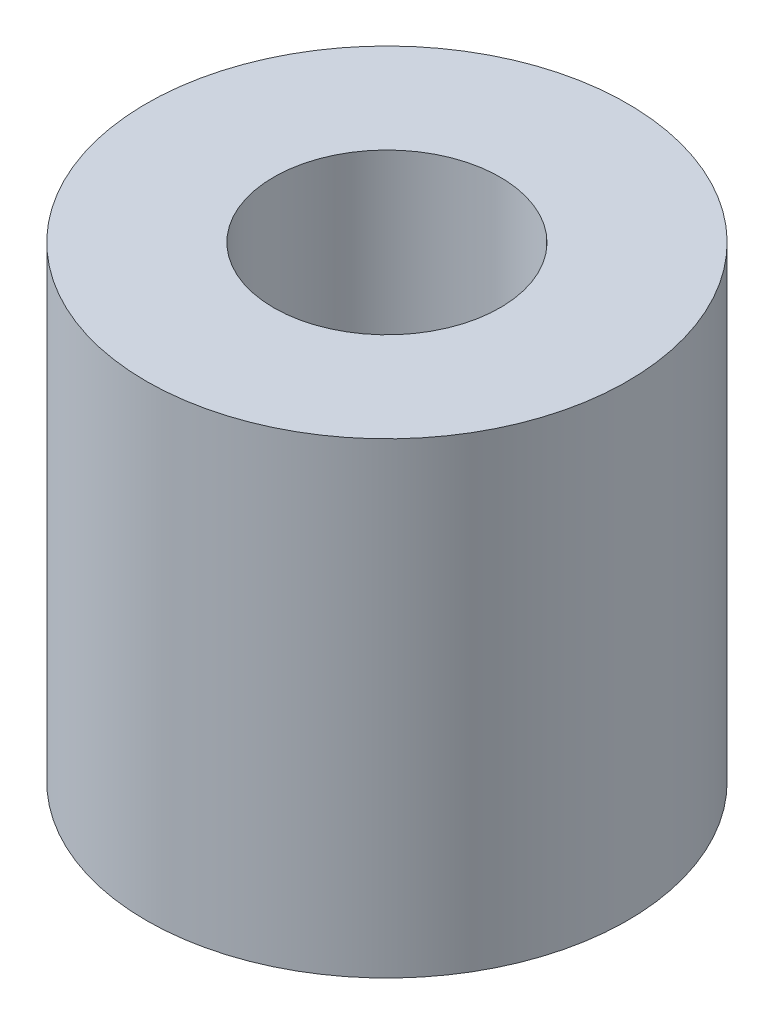
ISO-10303-21;
HEADER;
FILE_DESCRIPTION(('STEP AP214'),'2;1');
FILE_NAME('part.step','',(''),(''),'','','');
FILE_SCHEMA(('AUTOMOTIVE_DESIGN { 1 0 10303 214 1 1 1 1 }'));
ENDSEC;
DATA;
#1=APPLICATION_CONTEXT('core data for automotive mechanical design processes');
#2=APPLICATION_PROTOCOL_DEFINITION('international standard','automotive_design',2000,#1);
#3=PRODUCT_CONTEXT('',#1,'mechanical');
#4=PRODUCT('Part','Part','',(#3));
#5=PRODUCT_RELATED_PRODUCT_CATEGORY('part','',(#4));
#6=PRODUCT_DEFINITION_FORMATION('','',#4);
#7=PRODUCT_DEFINITION_CONTEXT('part definition',#1,'design');
#8=PRODUCT_DEFINITION('design','',#6,#7);
#9=PRODUCT_DEFINITION_SHAPE('','',#8);
#10=(LENGTH_UNIT() NAMED_UNIT(*) SI_UNIT(.MILLI.,.METRE.));
#11=(NAMED_UNIT(*) PLANE_ANGLE_UNIT() SI_UNIT($,.RADIAN.));
#12=(NAMED_UNIT(*) SI_UNIT($,.STERADIAN.) SOLID_ANGLE_UNIT());
#13=UNCERTAINTY_MEASURE_WITH_UNIT(LENGTH_MEASURE(1.E-05),#10,'distance_accuracy_value','');
#14=(GEOMETRIC_REPRESENTATION_CONTEXT(3) GLOBAL_UNCERTAINTY_ASSIGNED_CONTEXT((#13)) GLOBAL_UNIT_ASSIGNED_CONTEXT((#10,
#11,#12)) REPRESENTATION_CONTEXT('',''));
#15=CARTESIAN_POINT('',(0.,0.,0.));
#16=DIRECTION('',(0.,0.,1.));
#17=DIRECTION('',(1.,0.,0.));
#18=AXIS2_PLACEMENT_3D('',#15,#16,#17);
#19=CARTESIAN_POINT('',(0.,33.,0.));
#20=DIRECTION('',(0.,1.,0.));
#21=DIRECTION('',(0.,0.,1.));
#22=AXIS2_PLACEMENT_3D('',#19,#20,#21);
#23=PLANE('',#22);
#24=CARTESIAN_POINT('',(0.,33.,0.));
#25=DIRECTION('',(0.,1.,0.));
#26=DIRECTION('',(0.,0.,1.));
#27=AXIS2_PLACEMENT_3D('',#24,#25,#26);
#28=CIRCLE('',#27,17.);
#29=CARTESIAN_POINT('',(0.,33.,17.));
#30=VERTEX_POINT('',#29);
#31=EDGE_CURVE('E10',#30,#30,#28,.T.);
#32=ORIENTED_EDGE('',*,*,#31,.T.);
#33=EDGE_LOOP('',(#32));
#34=FACE_BOUND('',#33,.T.);
#35=CARTESIAN_POINT('',(0.,33.,0.));
#36=DIRECTION('',(0.,1.,0.));
#37=DIRECTION('',(0.,0.,1.));
#38=AXIS2_PLACEMENT_3D('',#35,#36,#37);
#39=CIRCLE('',#38,8.);
#40=CARTESIAN_POINT('',(0.,33.,8.));
#41=VERTEX_POINT('',#40);
#42=EDGE_CURVE('E45',#41,#41,#39,.T.);
#43=ORIENTED_EDGE('',*,*,#42,.F.);
#44=EDGE_LOOP('',(#43));
#45=FACE_BOUND('',#44,.T.);
#46=ADVANCED_FACE('F34',(#34,#45),#23,.T.);
#47=CARTESIAN_POINT('',(0.,0.,0.));
#48=DIRECTION('',(0.,1.,0.));
#49=DIRECTION('',(0.,0.,1.));
#50=AXIS2_PLACEMENT_3D('',#47,#48,#49);
#51=PLANE('',#50);
#52=CARTESIAN_POINT('',(0.,0.,0.));
#53=DIRECTION('',(0.,1.,0.));
#54=DIRECTION('',(0.,0.,1.));
#55=AXIS2_PLACEMENT_3D('',#52,#53,#54);
#56=CIRCLE('',#55,17.);
#57=CARTESIAN_POINT('',(0.,0.,17.));
#58=VERTEX_POINT('',#57);
#59=EDGE_CURVE('E38',#58,#58,#56,.T.);
#60=ORIENTED_EDGE('',*,*,#59,.F.);
#61=EDGE_LOOP('',(#60));
#62=FACE_BOUND('',#61,.T.);
#63=CARTESIAN_POINT('',(0.,0.,0.));
#64=DIRECTION('',(0.,1.,0.));
#65=DIRECTION('',(0.,0.,1.));
#66=AXIS2_PLACEMENT_3D('',#63,#64,#65);
#67=CIRCLE('',#66,8.);
#68=CARTESIAN_POINT('',(0.,0.,8.));
#69=VERTEX_POINT('',#68);
#70=EDGE_CURVE('E47',#69,#69,#67,.T.);
#71=ORIENTED_EDGE('',*,*,#70,.T.);
#72=EDGE_LOOP('',(#71));
#73=FACE_BOUND('',#72,.T.);
#74=ADVANCED_FACE('F57',(#62,#73),#51,.F.);
#75=CARTESIAN_POINT('',(0.,33.,0.));
#76=DIRECTION('',(0.,-1.,0.));
#77=DIRECTION('',(0.,0.,-1.));
#78=AXIS2_PLACEMENT_3D('',#75,#76,#77);
#79=CYLINDRICAL_SURFACE('',#78,17.);
#80=ORIENTED_EDGE('',*,*,#31,.F.);
#81=EDGE_LOOP('',(#80));
#82=FACE_BOUND('',#81,.T.);
#83=ORIENTED_EDGE('',*,*,#59,.T.);
#84=EDGE_LOOP('',(#83));
#85=FACE_BOUND('',#84,.T.);
#86=ADVANCED_FACE('F36',(#82,#85),#79,.T.);
#87=CARTESIAN_POINT('',(0.,33.,0.));
#88=DIRECTION('',(0.,-1.,0.));
#89=DIRECTION('',(0.,0.,-1.));
#90=AXIS2_PLACEMENT_3D('',#87,#88,#89);
#91=CYLINDRICAL_SURFACE('',#90,8.);
#92=ORIENTED_EDGE('',*,*,#42,.T.);
#93=EDGE_LOOP('',(#92));
#94=FACE_BOUND('',#93,.T.);
#95=ORIENTED_EDGE('',*,*,#70,.F.);
#96=EDGE_LOOP('',(#95));
#97=FACE_BOUND('',#96,.T.);
#98=ADVANCED_FACE('F53',(#94,#97),#91,.F.);
#99=CLOSED_SHELL('',(#46,#74,#86,#98));
#100=MANIFOLD_SOLID_BREP('B2',#99);
#101=ADVANCED_BREP_SHAPE_REPRESENTATION('',(#18,#100),#14);
#102=SHAPE_DEFINITION_REPRESENTATION(#9,#101);
ENDSEC;
END-ISO-10303-21;
